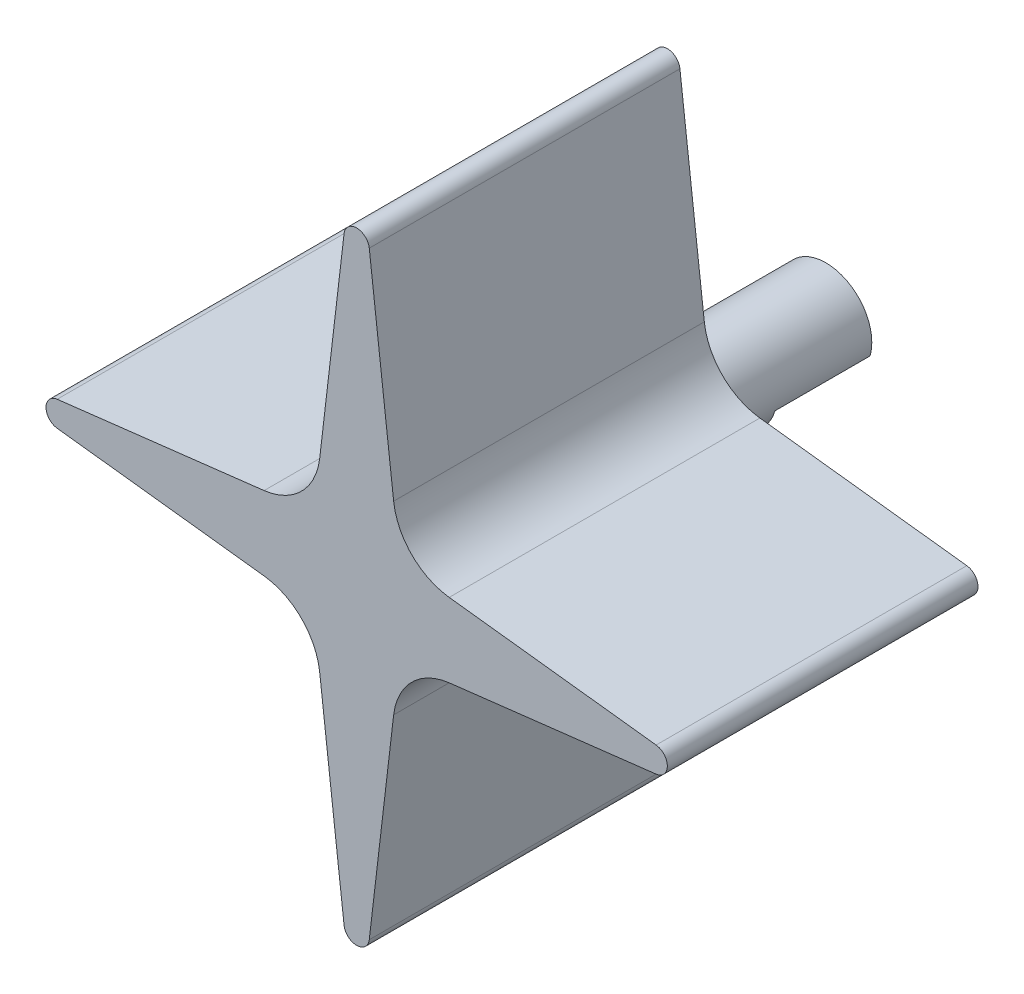
ISO-10303-21;
HEADER;
FILE_DESCRIPTION(('STEP AP214'),'2;1');
FILE_NAME('part.step','',(''),(''),'','','');
FILE_SCHEMA(('AUTOMOTIVE_DESIGN { 1 0 10303 214 1 1 1 1 }'));
ENDSEC;
DATA;
#1=APPLICATION_CONTEXT('core data for automotive mechanical design processes');
#2=APPLICATION_PROTOCOL_DEFINITION('international standard','automotive_design',2000,#1);
#3=PRODUCT_CONTEXT('',#1,'mechanical');
#4=PRODUCT('Part','Part','',(#3));
#5=PRODUCT_RELATED_PRODUCT_CATEGORY('part','',(#4));
#6=PRODUCT_DEFINITION_FORMATION('','',#4);
#7=PRODUCT_DEFINITION_CONTEXT('part definition',#1,'design');
#8=PRODUCT_DEFINITION('design','',#6,#7);
#9=PRODUCT_DEFINITION_SHAPE('','',#8);
#10=(LENGTH_UNIT() NAMED_UNIT(*) SI_UNIT(.MILLI.,.METRE.));
#11=(NAMED_UNIT(*) PLANE_ANGLE_UNIT() SI_UNIT($,.RADIAN.));
#12=(NAMED_UNIT(*) SI_UNIT($,.STERADIAN.) SOLID_ANGLE_UNIT());
#13=UNCERTAINTY_MEASURE_WITH_UNIT(LENGTH_MEASURE(1.E-05),#10,'distance_accuracy_value','');
#14=(GEOMETRIC_REPRESENTATION_CONTEXT(3) GLOBAL_UNCERTAINTY_ASSIGNED_CONTEXT((#13)) GLOBAL_UNIT_ASSIGNED_CONTEXT((#10,
#11,#12)) REPRESENTATION_CONTEXT('',''));
#15=CARTESIAN_POINT('',(0.,0.,0.));
#16=DIRECTION('',(0.,0.,1.));
#17=DIRECTION('',(1.,0.,0.));
#18=AXIS2_PLACEMENT_3D('',#15,#16,#17);
#19=CARTESIAN_POINT('',(-7.44847055920506,0.877659574468085,49.));
#20=DIRECTION('',(-0.993129407894008,0.117021276595745,0.));
#21=DIRECTION('',(-0.117021276595745,-0.993129407894008,0.));
#22=AXIS2_PLACEMENT_3D('',#19,#20,#21);
#23=PLANE('',#22);
#24=DIRECTION('',(0.117021276595745,0.993129407894008,0.));
#25=VECTOR('',#24,1.);
#26=CARTESIAN_POINT('',(-7.44847055920506,0.877659574468085,0.));
#27=LINE('',#26,#25);
#28=CARTESIAN_POINT('',(-5.8323317463625,14.5934130593451,0.));
#29=VERTEX_POINT('',#28);
#30=CARTESIAN_POINT('',(-1.98625881578801,47.2340425531915,0.));
#31=VERTEX_POINT('',#30);
#32=EDGE_CURVE('E188',#29,#31,#27,.T.);
#33=ORIENTED_EDGE('',*,*,#32,.F.);
#34=DIRECTION('',(0.,0.,-1.));
#35=VECTOR('',#34,1.);
#36=CARTESIAN_POINT('',(-5.8323317463625,14.5934130593451,49.));
#37=LINE('',#36,#35);
#38=CARTESIAN_POINT('',(-5.8323317463625,14.5934130593451,49.));
#39=VERTEX_POINT('',#38);
#40=EDGE_CURVE('E275',#29,#39,#37,.F.);
#41=ORIENTED_EDGE('',*,*,#40,.T.);
#42=DIRECTION('',(0.117021276595745,0.993129407894008,0.));
#43=VECTOR('',#42,1.);
#44=CARTESIAN_POINT('',(-7.44847055920506,0.877659574468085,49.));
#45=LINE('',#44,#43);
#46=CARTESIAN_POINT('',(-1.98625881578801,47.2340425531915,49.));
#47=VERTEX_POINT('',#46);
#48=EDGE_CURVE('E189',#39,#47,#45,.T.);
#49=ORIENTED_EDGE('',*,*,#48,.T.);
#50=DIRECTION('',(0.,0.,-1.));
#51=VECTOR('',#50,1.);
#52=CARTESIAN_POINT('',(-1.98625881578801,47.2340425531915,49.));
#53=LINE('',#52,#51);
#54=EDGE_CURVE('E222',#47,#31,#53,.T.);
#55=ORIENTED_EDGE('',*,*,#54,.T.);
#56=EDGE_LOOP('',(#33,#41,#49,#55));
#57=FACE_BOUND('',#56,.T.);
#58=ADVANCED_FACE('F41',(#57),#23,.T.);
#59=CARTESIAN_POINT('',(-0.877659574468087,7.44847055920506,49.));
#60=DIRECTION('',(-0.117021276595745,0.993129407894008,0.));
#61=DIRECTION('',(-0.993129407894008,-0.117021276595745,0.));
#62=AXIS2_PLACEMENT_3D('',#59,#60,#61);
#63=PLANE('',#62);
#64=DIRECTION('',(0.993129407894008,0.117021276595745,0.));
#65=VECTOR('',#64,1.);
#66=CARTESIAN_POINT('',(-0.877659574468087,7.44847055920506,49.));
#67=LINE('',#66,#65);
#68=CARTESIAN_POINT('',(-47.2340425531917,1.98625881578799,49.));
#69=VERTEX_POINT('',#68);
#70=CARTESIAN_POINT('',(-14.5934130593451,5.83233174636251,49.));
#71=VERTEX_POINT('',#70);
#72=EDGE_CURVE('E191',#69,#71,#67,.T.);
#73=ORIENTED_EDGE('',*,*,#72,.T.);
#74=DIRECTION('',(0.,0.,-1.));
#75=VECTOR('',#74,1.);
#76=CARTESIAN_POINT('',(-14.5934130593451,5.83233174636251,0.));
#77=LINE('',#76,#75);
#78=CARTESIAN_POINT('',(-14.5934130593451,5.83233174636251,0.));
#79=VERTEX_POINT('',#78);
#80=EDGE_CURVE('E272',#71,#79,#77,.T.);
#81=ORIENTED_EDGE('',*,*,#80,.T.);
#82=DIRECTION('',(0.993129407894008,0.117021276595745,0.));
#83=VECTOR('',#82,1.);
#84=CARTESIAN_POINT('',(-0.877659574468087,7.44847055920506,0.));
#85=LINE('',#84,#83);
#86=CARTESIAN_POINT('',(-47.2340425531917,1.98625881578799,0.));
#87=VERTEX_POINT('',#86);
#88=EDGE_CURVE('E224',#87,#79,#85,.T.);
#89=ORIENTED_EDGE('',*,*,#88,.F.);
#90=DIRECTION('',(0.,0.,-1.));
#91=VECTOR('',#90,1.);
#92=CARTESIAN_POINT('',(-47.2340425531917,1.98625881578799,49.));
#93=LINE('',#92,#91);
#94=EDGE_CURVE('E270',#69,#87,#93,.T.);
#95=ORIENTED_EDGE('',*,*,#94,.F.);
#96=EDGE_LOOP('',(#73,#81,#89,#95));
#97=FACE_BOUND('',#96,.T.);
#98=ADVANCED_FACE('F363',(#97),#63,.T.);
#99=CARTESIAN_POINT('',(-47.0000000000002,0.,49.));
#100=DIRECTION('',(0.,0.,-1.));
#101=DIRECTION('',(-1.,0.,0.));
#102=AXIS2_PLACEMENT_3D('',#99,#100,#101);
#103=CYLINDRICAL_SURFACE('',#102,2.);
#104=CARTESIAN_POINT('',(-47.0000000000002,0.,0.));
#105=DIRECTION('',(0.,0.,1.));
#106=DIRECTION('',(1.,0.,0.));
#107=AXIS2_PLACEMENT_3D('',#104,#105,#106);
#108=CIRCLE('',#107,2.);
#109=CARTESIAN_POINT('',(-47.2340425531917,-1.98625881578803,0.));
#110=VERTEX_POINT('',#109);
#111=EDGE_CURVE('E227',#110,#87,#108,.F.);
#112=ORIENTED_EDGE('',*,*,#111,.F.);
#113=DIRECTION('',(0.,0.,-1.));
#114=VECTOR('',#113,1.);
#115=CARTESIAN_POINT('',(-47.2340425531917,-1.98625881578803,49.));
#116=LINE('',#115,#114);
#117=CARTESIAN_POINT('',(-47.2340425531917,-1.98625881578803,49.));
#118=VERTEX_POINT('',#117);
#119=EDGE_CURVE('E267',#118,#110,#116,.T.);
#120=ORIENTED_EDGE('',*,*,#119,.F.);
#121=CARTESIAN_POINT('',(-47.0000000000002,0.,49.));
#122=DIRECTION('',(0.,0.,1.));
#123=DIRECTION('',(1.,0.,0.));
#124=AXIS2_PLACEMENT_3D('',#121,#122,#123);
#125=CIRCLE('',#124,2.);
#126=EDGE_CURVE('E195',#118,#69,#125,.F.);
#127=ORIENTED_EDGE('',*,*,#126,.T.);
#128=ORIENTED_EDGE('',*,*,#94,.T.);
#129=EDGE_LOOP('',(#112,#120,#127,#128));
#130=FACE_BOUND('',#129,.T.);
#131=ADVANCED_FACE('F359',(#130),#103,.T.);
#132=CARTESIAN_POINT('',(-0.877659574468087,-7.44847055920509,49.));
#133=DIRECTION('',(-0.117021276595744,-0.993129407894008,0.));
#134=DIRECTION('',(0.993129407894008,-0.117021276595744,0.));
#135=AXIS2_PLACEMENT_3D('',#132,#133,#134);
#136=PLANE('',#135);
#137=DIRECTION('',(-0.993129407894008,0.117021276595745,0.));
#138=VECTOR('',#137,1.);
#139=CARTESIAN_POINT('',(-0.877659574468087,-7.44847055920509,0.));
#140=LINE('',#139,#138);
#141=CARTESIAN_POINT('',(-14.5934130593453,-5.83233174636252,0.));
#142=VERTEX_POINT('',#141);
#143=EDGE_CURVE('E230',#142,#110,#140,.T.);
#144=ORIENTED_EDGE('',*,*,#143,.F.);
#145=DIRECTION('',(0.,0.,-1.));
#146=VECTOR('',#145,1.);
#147=CARTESIAN_POINT('',(-14.5934130593453,-5.83233174636252,49.));
#148=LINE('',#147,#146);
#149=CARTESIAN_POINT('',(-14.5934130593453,-5.83233174636252,49.));
#150=VERTEX_POINT('',#149);
#151=EDGE_CURVE('E280',#142,#150,#148,.F.);
#152=ORIENTED_EDGE('',*,*,#151,.T.);
#153=DIRECTION('',(-0.993129407894008,0.117021276595745,0.));
#154=VECTOR('',#153,1.);
#155=CARTESIAN_POINT('',(-0.877659574468087,-7.44847055920509,49.));
#156=LINE('',#155,#154);
#157=EDGE_CURVE('E198',#150,#118,#156,.T.);
#158=ORIENTED_EDGE('',*,*,#157,.T.);
#159=ORIENTED_EDGE('',*,*,#119,.T.);
#160=EDGE_LOOP('',(#144,#152,#158,#159));
#161=FACE_BOUND('',#160,.T.);
#162=ADVANCED_FACE('F353',(#161),#136,.T.);
#163=CARTESIAN_POINT('',(-7.44847055920523,-0.877659574468106,49.));
#164=DIRECTION('',(-0.993129407894008,-0.117021276595745,0.));
#165=DIRECTION('',(0.117021276595745,-0.993129407894008,0.));
#166=AXIS2_PLACEMENT_3D('',#163,#164,#165);
#167=PLANE('',#166);
#168=DIRECTION('',(-0.117021276595745,0.993129407894008,0.));
#169=VECTOR('',#168,1.);
#170=CARTESIAN_POINT('',(-7.44847055920523,-0.877659574468106,49.));
#171=LINE('',#170,#169);
#172=CARTESIAN_POINT('',(-1.98625881578817,-47.2340425531917,49.));
#173=VERTEX_POINT('',#172);
#174=CARTESIAN_POINT('',(-5.83233174636268,-14.5934130593451,49.));
#175=VERTEX_POINT('',#174);
#176=EDGE_CURVE('E200',#173,#175,#171,.T.);
#177=ORIENTED_EDGE('',*,*,#176,.T.);
#178=DIRECTION('',(0.,0.,-1.));
#179=VECTOR('',#178,1.);
#180=CARTESIAN_POINT('',(-5.83233174636268,-14.5934130593451,0.));
#181=LINE('',#180,#179);
#182=CARTESIAN_POINT('',(-5.83233174636268,-14.5934130593451,0.));
#183=VERTEX_POINT('',#182);
#184=EDGE_CURVE('E277',#175,#183,#181,.T.);
#185=ORIENTED_EDGE('',*,*,#184,.T.);
#186=DIRECTION('',(-0.117021276595745,0.993129407894008,0.));
#187=VECTOR('',#186,1.);
#188=CARTESIAN_POINT('',(-7.44847055920523,-0.877659574468106,0.));
#189=LINE('',#188,#187);
#190=CARTESIAN_POINT('',(-1.98625881578817,-47.2340425531917,0.));
#191=VERTEX_POINT('',#190);
#192=EDGE_CURVE('E232',#191,#183,#189,.T.);
#193=ORIENTED_EDGE('',*,*,#192,.F.);
#194=DIRECTION('',(0.,0.,-1.));
#195=VECTOR('',#194,1.);
#196=CARTESIAN_POINT('',(-1.98625881578817,-47.2340425531917,49.));
#197=LINE('',#196,#195);
#198=EDGE_CURVE('E265',#173,#191,#197,.T.);
#199=ORIENTED_EDGE('',*,*,#198,.F.);
#200=EDGE_LOOP('',(#177,#185,#193,#199));
#201=FACE_BOUND('',#200,.T.);
#202=ADVANCED_FACE('F345',(#201),#167,.T.);
#203=CARTESIAN_POINT('',(-1.50812522192734E-13,-47.0000000000002,49.));
#204=DIRECTION('',(0.,0.,-1.));
#205=DIRECTION('',(-1.,0.,0.));
#206=AXIS2_PLACEMENT_3D('',#203,#204,#205);
#207=CYLINDRICAL_SURFACE('',#206,2.);
#208=CARTESIAN_POINT('',(-1.50812522192734E-13,-47.0000000000002,0.));
#209=DIRECTION('',(0.,0.,1.));
#210=DIRECTION('',(1.,0.,0.));
#211=AXIS2_PLACEMENT_3D('',#208,#209,#210);
#212=CIRCLE('',#211,2.);
#213=CARTESIAN_POINT('',(1.98625881578786,-47.2340425531917,0.));
#214=VERTEX_POINT('',#213);
#215=EDGE_CURVE('E235',#214,#191,#212,.F.);
#216=ORIENTED_EDGE('',*,*,#215,.F.);
#217=DIRECTION('',(0.,0.,-1.));
#218=VECTOR('',#217,1.);
#219=CARTESIAN_POINT('',(1.98625881578786,-47.2340425531917,49.));
#220=LINE('',#219,#218);
#221=CARTESIAN_POINT('',(1.98625881578786,-47.2340425531917,49.));
#222=VERTEX_POINT('',#221);
#223=EDGE_CURVE('E262',#222,#214,#220,.T.);
#224=ORIENTED_EDGE('',*,*,#223,.F.);
#225=CARTESIAN_POINT('',(-1.50812522192734E-13,-47.0000000000002,49.));
#226=DIRECTION('',(0.,0.,1.));
#227=DIRECTION('',(1.,0.,0.));
#228=AXIS2_PLACEMENT_3D('',#225,#226,#227);
#229=CIRCLE('',#228,2.);
#230=EDGE_CURVE('E203',#222,#173,#229,.F.);
#231=ORIENTED_EDGE('',*,*,#230,.T.);
#232=ORIENTED_EDGE('',*,*,#198,.T.);
#233=EDGE_LOOP('',(#216,#224,#231,#232));
#234=FACE_BOUND('',#233,.T.);
#235=ADVANCED_FACE('F341',(#234),#207,.T.);
#236=CARTESIAN_POINT('',(7.44847055920492,-0.877659574468068,49.));
#237=DIRECTION('',(0.993129407894007,-0.117021276595745,0.));
#238=DIRECTION('',(0.117021276595745,0.993129407894008,0.));
#239=AXIS2_PLACEMENT_3D('',#236,#237,#238);
#240=PLANE('',#239);
#241=DIRECTION('',(-0.117021276595745,-0.993129407894008,0.));
#242=VECTOR('',#241,1.);
#243=CARTESIAN_POINT('',(7.44847055920492,-0.877659574468068,0.));
#244=LINE('',#243,#242);
#245=CARTESIAN_POINT('',(5.83233174636235,-14.5934130593453,0.));
#246=VERTEX_POINT('',#245);
#247=EDGE_CURVE('E238',#246,#214,#244,.T.);
#248=ORIENTED_EDGE('',*,*,#247,.F.);
#249=DIRECTION('',(0.,0.,-1.));
#250=VECTOR('',#249,1.);
#251=CARTESIAN_POINT('',(5.83233174636235,-14.5934130593453,49.));
#252=LINE('',#251,#250);
#253=CARTESIAN_POINT('',(5.83233174636235,-14.5934130593453,49.));
#254=VERTEX_POINT('',#253);
#255=EDGE_CURVE('E285',#246,#254,#252,.F.);
#256=ORIENTED_EDGE('',*,*,#255,.T.);
#257=DIRECTION('',(-0.117021276595745,-0.993129407894008,0.));
#258=VECTOR('',#257,1.);
#259=CARTESIAN_POINT('',(7.44847055920492,-0.877659574468068,49.));
#260=LINE('',#259,#258);
#261=EDGE_CURVE('E206',#254,#222,#260,.T.);
#262=ORIENTED_EDGE('',*,*,#261,.T.);
#263=ORIENTED_EDGE('',*,*,#223,.T.);
#264=EDGE_LOOP('',(#248,#256,#262,#263));
#265=FACE_BOUND('',#264,.T.);
#266=ADVANCED_FACE('F335',(#265),#240,.T.);
#267=CARTESIAN_POINT('',(0.877659574468105,-7.44847055920522,49.));
#268=DIRECTION('',(0.117021276595745,-0.993129407894008,0.));
#269=DIRECTION('',(0.993129407894008,0.117021276595745,0.));
#270=AXIS2_PLACEMENT_3D('',#267,#268,#269);
#271=PLANE('',#270);
#272=DIRECTION('',(-0.993129407894008,-0.117021276595745,0.));
#273=VECTOR('',#272,1.);
#274=CARTESIAN_POINT('',(0.877659574468105,-7.44847055920522,49.));
#275=LINE('',#274,#273);
#276=CARTESIAN_POINT('',(47.2340425531915,-1.98625881578818,49.));
#277=VERTEX_POINT('',#276);
#278=CARTESIAN_POINT('',(14.593413059345,-5.83233174636269,49.));
#279=VERTEX_POINT('',#278);
#280=EDGE_CURVE('E208',#277,#279,#275,.T.);
#281=ORIENTED_EDGE('',*,*,#280,.T.);
#282=DIRECTION('',(0.,0.,-1.));
#283=VECTOR('',#282,1.);
#284=CARTESIAN_POINT('',(14.593413059345,-5.83233174636269,0.));
#285=LINE('',#284,#283);
#286=CARTESIAN_POINT('',(14.593413059345,-5.83233174636269,0.));
#287=VERTEX_POINT('',#286);
#288=EDGE_CURVE('E282',#279,#287,#285,.T.);
#289=ORIENTED_EDGE('',*,*,#288,.T.);
#290=DIRECTION('',(-0.993129407894008,-0.117021276595745,0.));
#291=VECTOR('',#290,1.);
#292=CARTESIAN_POINT('',(0.877659574468105,-7.44847055920522,0.));
#293=LINE('',#292,#291);
#294=CARTESIAN_POINT('',(47.2340425531915,-1.98625881578818,0.));
#295=VERTEX_POINT('',#294);
#296=EDGE_CURVE('E240',#295,#287,#293,.T.);
#297=ORIENTED_EDGE('',*,*,#296,.F.);
#298=DIRECTION('',(0.,0.,-1.));
#299=VECTOR('',#298,1.);
#300=CARTESIAN_POINT('',(47.2340425531915,-1.98625881578818,49.));
#301=LINE('',#300,#299);
#302=EDGE_CURVE('E260',#277,#295,#301,.T.);
#303=ORIENTED_EDGE('',*,*,#302,.F.);
#304=EDGE_LOOP('',(#281,#289,#297,#303));
#305=FACE_BOUND('',#304,.T.);
#306=ADVANCED_FACE('F326',(#305),#271,.T.);
#307=CARTESIAN_POINT('',(47.,-1.6236489944965E-13,49.));
#308=DIRECTION('',(0.,0.,-1.));
#309=DIRECTION('',(-1.,0.,0.));
#310=AXIS2_PLACEMENT_3D('',#307,#308,#309);
#311=CYLINDRICAL_SURFACE('',#310,2.);
#312=CARTESIAN_POINT('',(47.,-1.6236489944965E-13,0.));
#313=DIRECTION('',(0.,0.,1.));
#314=DIRECTION('',(1.,0.,0.));
#315=AXIS2_PLACEMENT_3D('',#312,#313,#314);
#316=CIRCLE('',#315,2.);
#317=CARTESIAN_POINT('',(47.2340425531915,1.98625881578785,0.));
#318=VERTEX_POINT('',#317);
#319=EDGE_CURVE('E243',#318,#295,#316,.F.);
#320=ORIENTED_EDGE('',*,*,#319,.F.);
#321=DIRECTION('',(0.,0.,-1.));
#322=VECTOR('',#321,1.);
#323=CARTESIAN_POINT('',(47.2340425531915,1.98625881578785,49.));
#324=LINE('',#323,#322);
#325=CARTESIAN_POINT('',(47.2340425531915,1.98625881578785,49.));
#326=VERTEX_POINT('',#325);
#327=EDGE_CURVE('E257',#326,#318,#324,.T.);
#328=ORIENTED_EDGE('',*,*,#327,.F.);
#329=CARTESIAN_POINT('',(47.,-1.6236489944965E-13,49.));
#330=DIRECTION('',(0.,0.,1.));
#331=DIRECTION('',(1.,0.,0.));
#332=AXIS2_PLACEMENT_3D('',#329,#330,#331);
#333=CIRCLE('',#332,2.);
#334=EDGE_CURVE('E211',#326,#277,#333,.F.);
#335=ORIENTED_EDGE('',*,*,#334,.T.);
#336=ORIENTED_EDGE('',*,*,#302,.T.);
#337=EDGE_LOOP('',(#320,#328,#335,#336));
#338=FACE_BOUND('',#337,.T.);
#339=ADVANCED_FACE('F322',(#338),#311,.T.);
#340=CARTESIAN_POINT('',(0.877659574468065,7.44847055920489,49.));
#341=DIRECTION('',(0.117021276595745,0.993129407894007,0.));
#342=DIRECTION('',(-0.993129407894008,0.117021276595745,0.));
#343=AXIS2_PLACEMENT_3D('',#340,#341,#342);
#344=PLANE('',#343);
#345=DIRECTION('',(0.993129407894008,-0.117021276595745,0.));
#346=VECTOR('',#345,1.);
#347=CARTESIAN_POINT('',(0.877659574468065,7.44847055920489,0.));
#348=LINE('',#347,#346);
#349=CARTESIAN_POINT('',(14.5934130593452,5.83233174636234,0.));
#350=VERTEX_POINT('',#349);
#351=EDGE_CURVE('E246',#350,#318,#348,.T.);
#352=ORIENTED_EDGE('',*,*,#351,.F.);
#353=DIRECTION('',(0.,0.,-1.));
#354=VECTOR('',#353,1.);
#355=CARTESIAN_POINT('',(14.5934130593452,5.83233174636234,49.));
#356=LINE('',#355,#354);
#357=CARTESIAN_POINT('',(14.5934130593452,5.83233174636234,49.));
#358=VERTEX_POINT('',#357);
#359=EDGE_CURVE('E64',#350,#358,#356,.F.);
#360=ORIENTED_EDGE('',*,*,#359,.T.);
#361=DIRECTION('',(0.993129407894008,-0.117021276595745,0.));
#362=VECTOR('',#361,1.);
#363=CARTESIAN_POINT('',(0.877659574468065,7.44847055920489,49.));
#364=LINE('',#363,#362);
#365=EDGE_CURVE('E214',#358,#326,#364,.T.);
#366=ORIENTED_EDGE('',*,*,#365,.T.);
#367=ORIENTED_EDGE('',*,*,#327,.T.);
#368=EDGE_LOOP('',(#352,#360,#366,#367));
#369=FACE_BOUND('',#368,.T.);
#370=ADVANCED_FACE('F318',(#369),#344,.T.);
#371=CARTESIAN_POINT('',(7.44847055920506,0.877659574468085,49.));
#372=DIRECTION('',(0.993129407894008,0.117021276595745,0.));
#373=DIRECTION('',(-0.117021276595745,0.993129407894008,0.));
#374=AXIS2_PLACEMENT_3D('',#371,#372,#373);
#375=PLANE('',#374);
#376=DIRECTION('',(0.117021276595745,-0.993129407894008,0.));
#377=VECTOR('',#376,1.);
#378=CARTESIAN_POINT('',(7.44847055920506,0.877659574468085,49.));
#379=LINE('',#378,#377);
#380=CARTESIAN_POINT('',(1.98625881578801,47.2340425531915,49.));
#381=VERTEX_POINT('',#380);
#382=CARTESIAN_POINT('',(5.83233174636253,14.593413059345,49.));
#383=VERTEX_POINT('',#382);
#384=EDGE_CURVE('E216',#381,#383,#379,.T.);
#385=ORIENTED_EDGE('',*,*,#384,.T.);
#386=DIRECTION('',(0.,0.,-1.));
#387=VECTOR('',#386,1.);
#388=CARTESIAN_POINT('',(5.83233174636253,14.593413059345,0.));
#389=LINE('',#388,#387);
#390=CARTESIAN_POINT('',(5.83233174636253,14.593413059345,0.));
#391=VERTEX_POINT('',#390);
#392=EDGE_CURVE('E287',#383,#391,#389,.T.);
#393=ORIENTED_EDGE('',*,*,#392,.T.);
#394=DIRECTION('',(0.117021276595745,-0.993129407894008,0.));
#395=VECTOR('',#394,1.);
#396=CARTESIAN_POINT('',(7.44847055920506,0.877659574468085,0.));
#397=LINE('',#396,#395);
#398=CARTESIAN_POINT('',(1.98625881578801,47.2340425531915,0.));
#399=VERTEX_POINT('',#398);
#400=EDGE_CURVE('E248',#399,#391,#397,.T.);
#401=ORIENTED_EDGE('',*,*,#400,.F.);
#402=DIRECTION('',(0.,0.,-1.));
#403=VECTOR('',#402,1.);
#404=CARTESIAN_POINT('',(1.98625881578801,47.2340425531915,49.));
#405=LINE('',#404,#403);
#406=EDGE_CURVE('E255',#381,#399,#405,.T.);
#407=ORIENTED_EDGE('',*,*,#406,.F.);
#408=EDGE_LOOP('',(#385,#393,#401,#407));
#409=FACE_BOUND('',#408,.T.);
#410=ADVANCED_FACE('F314',(#409),#375,.T.);
#411=CARTESIAN_POINT('',(0.,47.,49.));
#412=DIRECTION('',(0.,0.,-1.));
#413=DIRECTION('',(-1.,0.,0.));
#414=AXIS2_PLACEMENT_3D('',#411,#412,#413);
#415=CYLINDRICAL_SURFACE('',#414,2.);
#416=CARTESIAN_POINT('',(0.,47.,0.));
#417=DIRECTION('',(0.,0.,1.));
#418=DIRECTION('',(1.,0.,0.));
#419=AXIS2_PLACEMENT_3D('',#416,#417,#418);
#420=CIRCLE('',#419,2.);
#421=EDGE_CURVE('E192',#31,#399,#420,.F.);
#422=ORIENTED_EDGE('',*,*,#421,.F.);
#423=ORIENTED_EDGE('',*,*,#54,.F.);
#424=CARTESIAN_POINT('',(0.,47.,49.));
#425=DIRECTION('',(0.,0.,1.));
#426=DIRECTION('',(1.,0.,0.));
#427=AXIS2_PLACEMENT_3D('',#424,#425,#426);
#428=CIRCLE('',#427,2.);
#429=EDGE_CURVE('E219',#47,#381,#428,.F.);
#430=ORIENTED_EDGE('',*,*,#429,.T.);
#431=ORIENTED_EDGE('',*,*,#406,.T.);
#432=EDGE_LOOP('',(#422,#423,#430,#431));
#433=FACE_BOUND('',#432,.T.);
#434=ADVANCED_FACE('F373',(#433),#415,.T.);
#435=CARTESIAN_POINT('',(0.,0.,49.));
#436=DIRECTION('',(0.,0.,1.));
#437=DIRECTION('',(1.,0.,0.));
#438=AXIS2_PLACEMENT_3D('',#435,#436,#437);
#439=PLANE('',#438);
#440=ORIENTED_EDGE('',*,*,#48,.F.);
#441=CARTESIAN_POINT('',(-15.7636258253026,15.7636258253026,49.));
#442=DIRECTION('',(0.,0.,1.));
#443=DIRECTION('',(1.,0.,0.));
#444=AXIS2_PLACEMENT_3D('',#441,#442,#443);
#445=CIRCLE('',#444,10.);
#446=EDGE_CURVE('E293',#39,#71,#445,.F.);
#447=ORIENTED_EDGE('',*,*,#446,.T.);
#448=ORIENTED_EDGE('',*,*,#72,.F.);
#449=ORIENTED_EDGE('',*,*,#126,.F.);
#450=ORIENTED_EDGE('',*,*,#157,.F.);
#451=CARTESIAN_POINT('',(-15.7636258253028,-15.7636258253026,49.));
#452=DIRECTION('',(0.,0.,1.));
#453=DIRECTION('',(1.,0.,0.));
#454=AXIS2_PLACEMENT_3D('',#451,#452,#453);
#455=CIRCLE('',#454,10.);
#456=EDGE_CURVE('E297',#150,#175,#455,.F.);
#457=ORIENTED_EDGE('',*,*,#456,.T.);
#458=ORIENTED_EDGE('',*,*,#176,.F.);
#459=ORIENTED_EDGE('',*,*,#230,.F.);
#460=ORIENTED_EDGE('',*,*,#261,.F.);
#461=CARTESIAN_POINT('',(15.7636258253024,-15.7636258253028,49.));
#462=DIRECTION('',(0.,0.,1.));
#463=DIRECTION('',(1.,0.,0.));
#464=AXIS2_PLACEMENT_3D('',#461,#462,#463);
#465=CIRCLE('',#464,10.);
#466=EDGE_CURVE('E301',#254,#279,#465,.F.);
#467=ORIENTED_EDGE('',*,*,#466,.T.);
#468=ORIENTED_EDGE('',*,*,#280,.F.);
#469=ORIENTED_EDGE('',*,*,#334,.F.);
#470=ORIENTED_EDGE('',*,*,#365,.F.);
#471=CARTESIAN_POINT('',(15.7636258253026,15.7636258253024,49.));
#472=DIRECTION('',(0.,0.,1.));
#473=DIRECTION('',(1.,0.,0.));
#474=AXIS2_PLACEMENT_3D('',#471,#472,#473);
#475=CIRCLE('',#474,10.);
#476=EDGE_CURVE('E49',#358,#383,#475,.F.);
#477=ORIENTED_EDGE('',*,*,#476,.T.);
#478=ORIENTED_EDGE('',*,*,#384,.F.);
#479=ORIENTED_EDGE('',*,*,#429,.F.);
#480=EDGE_LOOP('',(#440,#447,#448,#449,#450,#457,#458,#459,#460,#467,#468,#469,#470,#477,#478,#479));
#481=FACE_BOUND('',#480,.T.);
#482=ADVANCED_FACE('F308',(#481),#439,.T.);
#483=CARTESIAN_POINT('',(0.,0.,0.));
#484=DIRECTION('',(0.,0.,1.));
#485=DIRECTION('',(1.,0.,0.));
#486=AXIS2_PLACEMENT_3D('',#483,#484,#485);
#487=PLANE('',#486);
#488=CARTESIAN_POINT('',(-2.56739074444567E-13,-2.84494650060196E-13,0.));
#489=DIRECTION('',(0.,0.,1.));
#490=DIRECTION('',(1.,0.,0.));
#491=AXIS2_PLACEMENT_3D('',#488,#489,#490);
#492=CIRCLE('',#491,7.25);
#493=CARTESIAN_POINT('',(7.24999999999974,-2.84494650060196E-13,0.));
#494=VERTEX_POINT('',#493);
#495=EDGE_CURVE('E11',#494,#494,#492,.F.);
#496=ORIENTED_EDGE('',*,*,#495,.F.);
#497=EDGE_LOOP('',(#496));
#498=FACE_BOUND('',#497,.T.);
#499=ORIENTED_EDGE('',*,*,#88,.T.);
#500=CARTESIAN_POINT('',(-15.7636258253026,15.7636258253026,0.));
#501=DIRECTION('',(0.,0.,1.));
#502=DIRECTION('',(1.,0.,0.));
#503=AXIS2_PLACEMENT_3D('',#500,#501,#502);
#504=CIRCLE('',#503,10.);
#505=EDGE_CURVE('E291',#79,#29,#504,.T.);
#506=ORIENTED_EDGE('',*,*,#505,.T.);
#507=ORIENTED_EDGE('',*,*,#32,.T.);
#508=ORIENTED_EDGE('',*,*,#421,.T.);
#509=ORIENTED_EDGE('',*,*,#400,.T.);
#510=CARTESIAN_POINT('',(15.7636258253026,15.7636258253024,0.));
#511=DIRECTION('',(0.,0.,1.));
#512=DIRECTION('',(1.,0.,0.));
#513=AXIS2_PLACEMENT_3D('',#510,#511,#512);
#514=CIRCLE('',#513,10.);
#515=EDGE_CURVE('E303',#391,#350,#514,.T.);
#516=ORIENTED_EDGE('',*,*,#515,.T.);
#517=ORIENTED_EDGE('',*,*,#351,.T.);
#518=ORIENTED_EDGE('',*,*,#319,.T.);
#519=ORIENTED_EDGE('',*,*,#296,.T.);
#520=CARTESIAN_POINT('',(15.7636258253024,-15.7636258253028,0.));
#521=DIRECTION('',(0.,0.,1.));
#522=DIRECTION('',(1.,0.,0.));
#523=AXIS2_PLACEMENT_3D('',#520,#521,#522);
#524=CIRCLE('',#523,10.);
#525=EDGE_CURVE('E299',#287,#246,#524,.T.);
#526=ORIENTED_EDGE('',*,*,#525,.T.);
#527=ORIENTED_EDGE('',*,*,#247,.T.);
#528=ORIENTED_EDGE('',*,*,#215,.T.);
#529=ORIENTED_EDGE('',*,*,#192,.T.);
#530=CARTESIAN_POINT('',(-15.7636258253028,-15.7636258253026,0.));
#531=DIRECTION('',(0.,0.,1.));
#532=DIRECTION('',(1.,0.,0.));
#533=AXIS2_PLACEMENT_3D('',#530,#531,#532);
#534=CIRCLE('',#533,10.);
#535=EDGE_CURVE('E295',#183,#142,#534,.T.);
#536=ORIENTED_EDGE('',*,*,#535,.T.);
#537=ORIENTED_EDGE('',*,*,#143,.T.);
#538=ORIENTED_EDGE('',*,*,#111,.T.);
#539=EDGE_LOOP('',(#499,#506,#507,#508,#509,#516,#517,#518,#519,#526,#527,#528,#529,#536,#537,#538));
#540=FACE_BOUND('',#539,.T.);
#541=ADVANCED_FACE('F317',(#498,#540),#487,.F.);
#542=CARTESIAN_POINT('',(-15.7636258253026,15.7636258253026,49.));
#543=DIRECTION('',(0.,0.,1.));
#544=DIRECTION('',(1.,0.,0.));
#545=AXIS2_PLACEMENT_3D('',#542,#543,#544);
#546=CYLINDRICAL_SURFACE('',#545,10.);
#547=ORIENTED_EDGE('',*,*,#446,.F.);
#548=ORIENTED_EDGE('',*,*,#40,.F.);
#549=ORIENTED_EDGE('',*,*,#505,.F.);
#550=ORIENTED_EDGE('',*,*,#80,.F.);
#551=EDGE_LOOP('',(#547,#548,#549,#550));
#552=FACE_BOUND('',#551,.T.);
#553=ADVANCED_FACE('F367',(#552),#546,.F.);
#554=CARTESIAN_POINT('',(-15.7636258253028,-15.7636258253026,49.));
#555=DIRECTION('',(0.,0.,1.));
#556=DIRECTION('',(1.,0.,0.));
#557=AXIS2_PLACEMENT_3D('',#554,#555,#556);
#558=CYLINDRICAL_SURFACE('',#557,10.);
#559=ORIENTED_EDGE('',*,*,#456,.F.);
#560=ORIENTED_EDGE('',*,*,#151,.F.);
#561=ORIENTED_EDGE('',*,*,#535,.F.);
#562=ORIENTED_EDGE('',*,*,#184,.F.);
#563=EDGE_LOOP('',(#559,#560,#561,#562));
#564=FACE_BOUND('',#563,.T.);
#565=ADVANCED_FACE('F349',(#564),#558,.F.);
#566=CARTESIAN_POINT('',(15.7636258253024,-15.7636258253028,49.));
#567=DIRECTION('',(0.,0.,1.));
#568=DIRECTION('',(1.,0.,0.));
#569=AXIS2_PLACEMENT_3D('',#566,#567,#568);
#570=CYLINDRICAL_SURFACE('',#569,10.);
#571=ORIENTED_EDGE('',*,*,#466,.F.);
#572=ORIENTED_EDGE('',*,*,#255,.F.);
#573=ORIENTED_EDGE('',*,*,#525,.F.);
#574=ORIENTED_EDGE('',*,*,#288,.F.);
#575=EDGE_LOOP('',(#571,#572,#573,#574));
#576=FACE_BOUND('',#575,.T.);
#577=ADVANCED_FACE('F331',(#576),#570,.F.);
#578=CARTESIAN_POINT('',(15.7636258253026,15.7636258253024,49.));
#579=DIRECTION('',(0.,0.,1.));
#580=DIRECTION('',(1.,0.,0.));
#581=AXIS2_PLACEMENT_3D('',#578,#579,#580);
#582=CYLINDRICAL_SURFACE('',#581,10.);
#583=ORIENTED_EDGE('',*,*,#476,.F.);
#584=ORIENTED_EDGE('',*,*,#359,.F.);
#585=ORIENTED_EDGE('',*,*,#515,.F.);
#586=ORIENTED_EDGE('',*,*,#392,.F.);
#587=EDGE_LOOP('',(#583,#584,#585,#586));
#588=FACE_BOUND('',#587,.T.);
#589=ADVANCED_FACE('F43',(#588),#582,.F.);
#590=CARTESIAN_POINT('',(-2.56739074444567E-13,-2.84494650060196E-13,-25.));
#591=DIRECTION('',(0.,0.,1.));
#592=DIRECTION('',(1.,0.,0.));
#593=AXIS2_PLACEMENT_3D('',#590,#591,#592);
#594=CYLINDRICAL_SURFACE('',#593,7.25);
#595=CARTESIAN_POINT('',(-2.56739074444567E-13,-2.84494650060196E-13,-25.));
#596=DIRECTION('',(0.,0.,-1.));
#597=DIRECTION('',(-1.,0.,0.));
#598=AXIS2_PLACEMENT_3D('',#595,#596,#597);
#599=CIRCLE('',#598,7.25);
#600=CARTESIAN_POINT('',(-6.96867993238352,-2.,-25.));
#601=VERTEX_POINT('',#600);
#602=CARTESIAN_POINT('',(6.968679932383,-2.,-25.));
#603=VERTEX_POINT('',#602);
#604=EDGE_CURVE('E182',#601,#603,#599,.T.);
#605=ORIENTED_EDGE('',*,*,#604,.F.);
#606=DIRECTION('',(0.,0.,-1.));
#607=VECTOR('',#606,1.);
#608=CARTESIAN_POINT('',(-6.96867993238352,-2.,-10.));
#609=LINE('',#608,#607);
#610=CARTESIAN_POINT('',(-6.96867993238352,-2.,-10.));
#611=VERTEX_POINT('',#610);
#612=EDGE_CURVE('E56',#611,#601,#609,.T.);
#613=ORIENTED_EDGE('',*,*,#612,.F.);
#614=CARTESIAN_POINT('',(-2.56739074444567E-13,-2.84494650060196E-13,-10.));
#615=DIRECTION('',(0.,0.,-1.));
#616=DIRECTION('',(-1.,0.,0.));
#617=AXIS2_PLACEMENT_3D('',#614,#615,#616);
#618=CIRCLE('',#617,7.25);
#619=CARTESIAN_POINT('',(6.968679932383,-2.,-10.));
#620=VERTEX_POINT('',#619);
#621=EDGE_CURVE('E168',#620,#611,#618,.T.);
#622=ORIENTED_EDGE('',*,*,#621,.F.);
#623=DIRECTION('',(0.,0.,-1.));
#624=VECTOR('',#623,1.);
#625=CARTESIAN_POINT('',(6.968679932383,-2.,-10.));
#626=LINE('',#625,#624);
#627=EDGE_CURVE('E176',#620,#603,#626,.T.);
#628=ORIENTED_EDGE('',*,*,#627,.T.);
#629=EDGE_LOOP('',(#605,#613,#622,#628));
#630=FACE_BOUND('',#629,.T.);
#631=ORIENTED_EDGE('',*,*,#495,.T.);
#632=EDGE_LOOP('',(#631));
#633=FACE_BOUND('',#632,.T.);
#634=ADVANCED_FACE('F179',(#630,#633),#594,.T.);
#635=CARTESIAN_POINT('',(-2.56739074444567E-13,-2.84494650060196E-13,-25.));
#636=DIRECTION('',(0.,0.,-1.));
#637=DIRECTION('',(-1.,0.,0.));
#638=AXIS2_PLACEMENT_3D('',#635,#636,#637);
#639=PLANE('',#638);
#640=DIRECTION('',(1.,0.,0.));
#641=VECTOR('',#640,1.);
#642=CARTESIAN_POINT('',(0.,-2.,-25.));
#643=LINE('',#642,#641);
#644=EDGE_CURVE('E173',#601,#603,#643,.T.);
#645=ORIENTED_EDGE('',*,*,#644,.F.);
#646=ORIENTED_EDGE('',*,*,#604,.T.);
#647=EDGE_LOOP('',(#645,#646));
#648=FACE_BOUND('',#647,.T.);
#649=ADVANCED_FACE('F403',(#648),#639,.T.);
#650=CARTESIAN_POINT('',(0.,-2.,-10.));
#651=DIRECTION('',(0.,1.,0.));
#652=DIRECTION('',(0.,0.,1.));
#653=AXIS2_PLACEMENT_3D('',#650,#651,#652);
#654=PLANE('',#653);
#655=ORIENTED_EDGE('',*,*,#644,.T.);
#656=ORIENTED_EDGE('',*,*,#627,.F.);
#657=DIRECTION('',(1.,0.,0.));
#658=VECTOR('',#657,1.);
#659=CARTESIAN_POINT('',(0.,-2.,-10.));
#660=LINE('',#659,#658);
#661=EDGE_CURVE('E170',#611,#620,#660,.T.);
#662=ORIENTED_EDGE('',*,*,#661,.F.);
#663=ORIENTED_EDGE('',*,*,#612,.T.);
#664=EDGE_LOOP('',(#655,#656,#662,#663));
#665=FACE_BOUND('',#664,.T.);
#666=ADVANCED_FACE('F175',(#665),#654,.F.);
#667=CARTESIAN_POINT('',(0.,0.,-10.));
#668=DIRECTION('',(0.,0.,-1.));
#669=DIRECTION('',(-1.,0.,0.));
#670=AXIS2_PLACEMENT_3D('',#667,#668,#669);
#671=PLANE('',#670);
#672=ORIENTED_EDGE('',*,*,#621,.T.);
#673=ORIENTED_EDGE('',*,*,#661,.T.);
#674=EDGE_LOOP('',(#672,#673));
#675=FACE_BOUND('',#674,.T.);
#676=ADVANCED_FACE('F169',(#675),#671,.T.);
#677=CLOSED_SHELL('',(#58,#98,#131,#162,#202,#235,#266,#306,#339,#370,#410,#434,#482,#541,#553,
#565,#577,#589,#634,#649,#666,#676));
#678=MANIFOLD_SOLID_BREP('B2',#677);
#679=ADVANCED_BREP_SHAPE_REPRESENTATION('',(#18,#678),#14);
#680=SHAPE_DEFINITION_REPRESENTATION(#9,#679);
ENDSEC;
END-ISO-10303-21;
